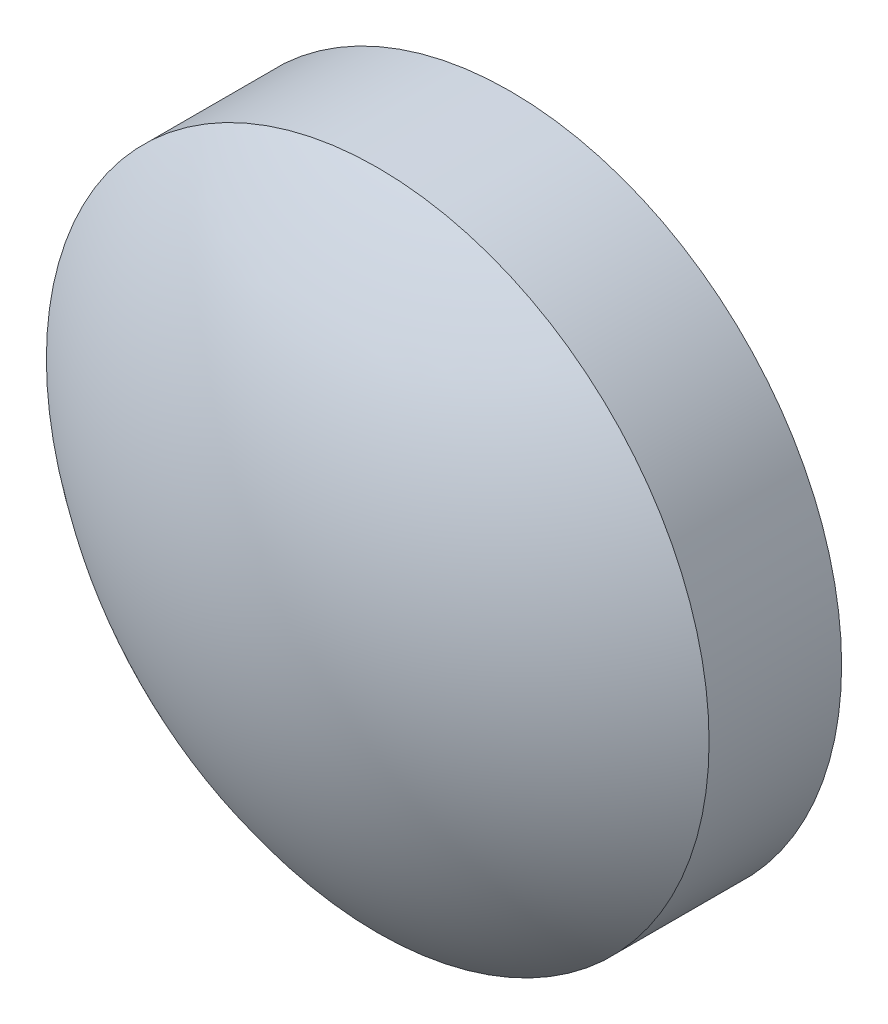
ISO-10303-21;
HEADER;
FILE_DESCRIPTION(('STEP AP214'),'2;1');
FILE_NAME('part.step','',(''),(''),'','','');
FILE_SCHEMA(('AUTOMOTIVE_DESIGN { 1 0 10303 214 1 1 1 1 }'));
ENDSEC;
DATA;
#1=APPLICATION_CONTEXT('core data for automotive mechanical design processes');
#2=APPLICATION_PROTOCOL_DEFINITION('international standard','automotive_design',2000,#1);
#3=PRODUCT_CONTEXT('',#1,'mechanical');
#4=PRODUCT('Part','Part','',(#3));
#5=PRODUCT_RELATED_PRODUCT_CATEGORY('part','',(#4));
#6=PRODUCT_DEFINITION_FORMATION('','',#4);
#7=PRODUCT_DEFINITION_CONTEXT('part definition',#1,'design');
#8=PRODUCT_DEFINITION('design','',#6,#7);
#9=PRODUCT_DEFINITION_SHAPE('','',#8);
#10=(LENGTH_UNIT() NAMED_UNIT(*) SI_UNIT(.MILLI.,.METRE.));
#11=(NAMED_UNIT(*) PLANE_ANGLE_UNIT() SI_UNIT($,.RADIAN.));
#12=(NAMED_UNIT(*) SI_UNIT($,.STERADIAN.) SOLID_ANGLE_UNIT());
#13=UNCERTAINTY_MEASURE_WITH_UNIT(LENGTH_MEASURE(1.E-05),#10,'distance_accuracy_value','');
#14=(GEOMETRIC_REPRESENTATION_CONTEXT(3) GLOBAL_UNCERTAINTY_ASSIGNED_CONTEXT((#13)) GLOBAL_UNIT_ASSIGNED_CONTEXT((#10,
#11,#12)) REPRESENTATION_CONTEXT('',''));
#15=CARTESIAN_POINT('',(0.,0.,0.));
#16=DIRECTION('',(0.,0.,1.));
#17=DIRECTION('',(1.,0.,0.));
#18=AXIS2_PLACEMENT_3D('',#15,#16,#17);
#19=CARTESIAN_POINT('',(0.,0.,1.));
#20=DIRECTION('',(0.,0.,-1.));
#21=DIRECTION('',(-1.,0.,0.));
#22=AXIS2_PLACEMENT_3D('',#19,#20,#21);
#23=CYLINDRICAL_SURFACE('',#22,2.5);
#24=CARTESIAN_POINT('',(0.,0.,1.));
#25=DIRECTION('',(0.,0.,1.));
#26=DIRECTION('',(1.,0.,0.));
#27=AXIS2_PLACEMENT_3D('',#24,#25,#26);
#28=CIRCLE('',#27,2.5);
#29=CARTESIAN_POINT('',(2.5,0.,1.));
#30=VERTEX_POINT('',#29);
#31=EDGE_CURVE('E10',#30,#30,#28,.T.);
#32=ORIENTED_EDGE('',*,*,#31,.F.);
#33=EDGE_LOOP('',(#32));
#34=FACE_BOUND('',#33,.T.);
#35=CARTESIAN_POINT('',(0.,0.,0.));
#36=DIRECTION('',(0.,0.,1.));
#37=DIRECTION('',(1.,0.,0.));
#38=AXIS2_PLACEMENT_3D('',#35,#36,#37);
#39=CIRCLE('',#38,2.5);
#40=CARTESIAN_POINT('',(2.5,0.,0.));
#41=VERTEX_POINT('',#40);
#42=EDGE_CURVE('E34',#41,#41,#39,.T.);
#43=ORIENTED_EDGE('',*,*,#42,.T.);
#44=EDGE_LOOP('',(#43));
#45=FACE_BOUND('',#44,.T.);
#46=ADVANCED_FACE('F31',(#34,#45),#23,.T.);
#47=CARTESIAN_POINT('',(0.,0.,0.));
#48=DIRECTION('',(0.,0.,1.));
#49=DIRECTION('',(1.,0.,0.));
#50=AXIS2_PLACEMENT_3D('',#47,#48,#49);
#51=PLANE('',#50);
#52=ORIENTED_EDGE('',*,*,#42,.F.);
#53=EDGE_LOOP('',(#52));
#54=FACE_BOUND('',#53,.T.);
#55=ADVANCED_FACE('F44',(#54),#51,.F.);
#56=CARTESIAN_POINT('',(0.,0.,-2.07109101135085));
#57=DIRECTION('',(0.,0.,-1.));
#58=DIRECTION('',(1.,0.,0.));
#59=AXIS2_PLACEMENT_3D('',#56,#57,#58);
#60=SPHERICAL_SURFACE('',#59,3.96);
#61=ORIENTED_EDGE('',*,*,#31,.T.);
#62=EDGE_LOOP('',(#61));
#63=FACE_BOUND('',#62,.T.);
#64=ADVANCED_FACE('F46',(#63),#60,.T.);
#65=CLOSED_SHELL('',(#46,#55,#64));
#66=MANIFOLD_SOLID_BREP('B2',#65);
#67=ADVANCED_BREP_SHAPE_REPRESENTATION('',(#18,#66),#14);
#68=SHAPE_DEFINITION_REPRESENTATION(#9,#67);
ENDSEC;
END-ISO-10303-21;
